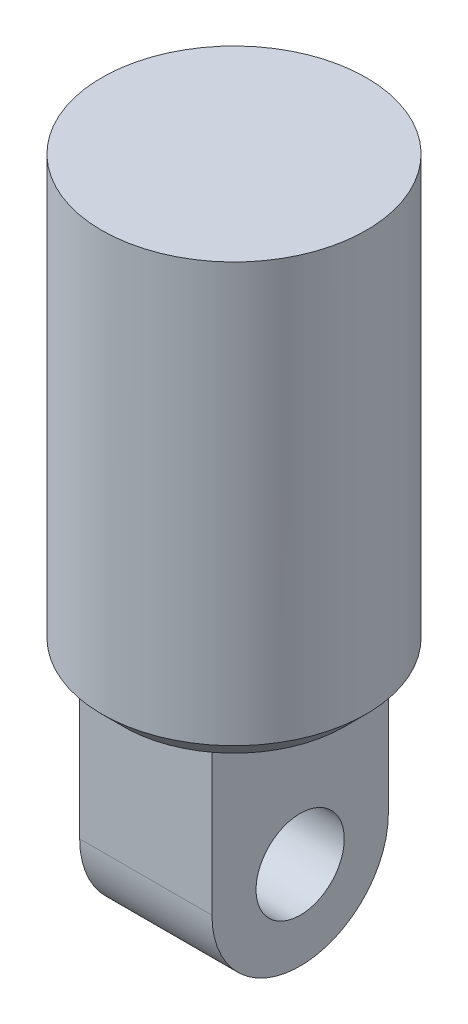
ISO-10303-21;
HEADER;
FILE_DESCRIPTION(('STEP AP214'),'2;1');
FILE_NAME('part.step','',(''),(''),'','','');
FILE_SCHEMA(('AUTOMOTIVE_DESIGN { 1 0 10303 214 1 1 1 1 }'));
ENDSEC;
DATA;
#1=APPLICATION_CONTEXT('core data for automotive mechanical design processes');
#2=APPLICATION_PROTOCOL_DEFINITION('international standard','automotive_design',2000,#1);
#3=PRODUCT_CONTEXT('',#1,'mechanical');
#4=PRODUCT('Part','Part','',(#3));
#5=PRODUCT_RELATED_PRODUCT_CATEGORY('part','',(#4));
#6=PRODUCT_DEFINITION_FORMATION('','',#4);
#7=PRODUCT_DEFINITION_CONTEXT('part definition',#1,'design');
#8=PRODUCT_DEFINITION('design','',#6,#7);
#9=PRODUCT_DEFINITION_SHAPE('','',#8);
#10=(LENGTH_UNIT() NAMED_UNIT(*) SI_UNIT(.MILLI.,.METRE.));
#11=(NAMED_UNIT(*) PLANE_ANGLE_UNIT() SI_UNIT($,.RADIAN.));
#12=(NAMED_UNIT(*) SI_UNIT($,.STERADIAN.) SOLID_ANGLE_UNIT());
#13=UNCERTAINTY_MEASURE_WITH_UNIT(LENGTH_MEASURE(1.E-05),#10,'distance_accuracy_value','');
#14=(GEOMETRIC_REPRESENTATION_CONTEXT(3) GLOBAL_UNCERTAINTY_ASSIGNED_CONTEXT((#13)) GLOBAL_UNIT_ASSIGNED_CONTEXT((#10,
#11,#12)) REPRESENTATION_CONTEXT('',''));
#15=CARTESIAN_POINT('',(0.,0.,0.));
#16=DIRECTION('',(0.,0.,1.));
#17=DIRECTION('',(1.,0.,0.));
#18=AXIS2_PLACEMENT_3D('',#15,#16,#17);
#19=CARTESIAN_POINT('',(30.,-100.,0.));
#20=DIRECTION('',(0.,-1.,0.));
#21=DIRECTION('',(0.,0.,-1.));
#22=AXIS2_PLACEMENT_3D('',#19,#20,#21);
#23=PLANE('',#22);
#24=DIRECTION('',(0.,0.,1.));
#25=VECTOR('',#24,1.);
#26=CARTESIAN_POINT('',(15.,-100.,20.));
#27=LINE('',#26,#25);
#28=CARTESIAN_POINT('',(15.,-100.,-20.));
#29=VERTEX_POINT('',#28);
#30=CARTESIAN_POINT('',(15.,-100.,20.));
#31=VERTEX_POINT('',#30);
#32=EDGE_CURVE('E93',#29,#31,#27,.T.);
#33=ORIENTED_EDGE('',*,*,#32,.F.);
#34=CARTESIAN_POINT('',(0.,-100.,0.));
#35=DIRECTION('',(0.,-1.,0.));
#36=DIRECTION('',(0.,0.,-1.));
#37=AXIS2_PLACEMENT_3D('',#34,#35,#36);
#38=CIRCLE('',#37,25.);
#39=EDGE_CURVE('E42',#29,#31,#38,.T.);
#40=ORIENTED_EDGE('',*,*,#39,.T.);
#41=EDGE_LOOP('',(#33,#40));
#42=FACE_BOUND('',#41,.T.);
#43=ADVANCED_FACE('F34',(#42),#23,.T.);
#44=DIRECTION('',(-1.,0.,0.));
#45=VECTOR('',#44,1.);
#46=CARTESIAN_POINT('',(15.,-100.,20.));
#47=LINE('',#46,#45);
#48=CARTESIAN_POINT('',(-15.,-100.,20.));
#49=VERTEX_POINT('',#48);
#50=EDGE_CURVE('E109',#31,#49,#47,.T.);
#51=ORIENTED_EDGE('',*,*,#50,.F.);
#52=CARTESIAN_POINT('',(0.,-100.,0.));
#53=DIRECTION('',(0.,-1.,0.));
#54=DIRECTION('',(0.,0.,-1.));
#55=AXIS2_PLACEMENT_3D('',#52,#53,#54);
#56=CIRCLE('',#55,25.);
#57=EDGE_CURVE('E49',#31,#49,#56,.T.);
#58=ORIENTED_EDGE('',*,*,#57,.T.);
#59=EDGE_LOOP('',(#51,#58));
#60=FACE_BOUND('',#59,.T.);
#61=ADVANCED_FACE('F124',(#60),#23,.T.);
#62=DIRECTION('',(0.,0.,1.));
#63=VECTOR('',#62,1.);
#64=CARTESIAN_POINT('',(-15.,-100.,20.));
#65=LINE('',#64,#63);
#66=CARTESIAN_POINT('',(-15.,-100.,-20.));
#67=VERTEX_POINT('',#66);
#68=EDGE_CURVE('E128',#67,#49,#65,.T.);
#69=ORIENTED_EDGE('',*,*,#68,.T.);
#70=CARTESIAN_POINT('',(0.,-100.,0.));
#71=DIRECTION('',(0.,-1.,0.));
#72=DIRECTION('',(0.,0.,-1.));
#73=AXIS2_PLACEMENT_3D('',#70,#71,#72);
#74=CIRCLE('',#73,25.);
#75=EDGE_CURVE('E114',#49,#67,#74,.T.);
#76=ORIENTED_EDGE('',*,*,#75,.T.);
#77=EDGE_LOOP('',(#69,#76));
#78=FACE_BOUND('',#77,.T.);
#79=ADVANCED_FACE('F163',(#78),#23,.T.);
#80=DIRECTION('',(-1.,0.,0.));
#81=VECTOR('',#80,1.);
#82=CARTESIAN_POINT('',(15.,-100.,-20.));
#83=LINE('',#82,#81);
#84=EDGE_CURVE('E91',#29,#67,#83,.T.);
#85=ORIENTED_EDGE('',*,*,#84,.T.);
#86=CARTESIAN_POINT('',(0.,-100.,0.));
#87=DIRECTION('',(0.,-1.,0.));
#88=DIRECTION('',(0.,0.,-1.));
#89=AXIS2_PLACEMENT_3D('',#86,#87,#88);
#90=CIRCLE('',#89,25.);
#91=EDGE_CURVE('E107',#67,#29,#90,.T.);
#92=ORIENTED_EDGE('',*,*,#91,.T.);
#93=EDGE_LOOP('',(#85,#92));
#94=FACE_BOUND('',#93,.T.);
#95=ADVANCED_FACE('F159',(#94),#23,.T.);
#96=CARTESIAN_POINT('',(0.,0.,0.));
#97=DIRECTION('',(0.,1.,0.));
#98=DIRECTION('',(0.,0.,1.));
#99=AXIS2_PLACEMENT_3D('',#96,#97,#98);
#100=PLANE('',#99);
#101=CARTESIAN_POINT('',(0.,0.,0.));
#102=DIRECTION('',(0.,-1.,0.));
#103=DIRECTION('',(0.,0.,-1.));
#104=AXIS2_PLACEMENT_3D('',#101,#102,#103);
#105=CIRCLE('',#104,30.);
#106=CARTESIAN_POINT('',(0.,0.,-30.));
#107=VERTEX_POINT('',#106);
#108=EDGE_CURVE('E104',#107,#107,#105,.T.);
#109=ORIENTED_EDGE('',*,*,#108,.F.);
#110=EDGE_LOOP('',(#109));
#111=FACE_BOUND('',#110,.T.);
#112=ADVANCED_FACE('F153',(#111),#100,.T.);
#113=CARTESIAN_POINT('',(0.,0.,0.));
#114=DIRECTION('',(0.,-1.,0.));
#115=DIRECTION('',(0.,0.,-1.));
#116=AXIS2_PLACEMENT_3D('',#113,#114,#115);
#117=CYLINDRICAL_SURFACE('',#116,30.);
#118=CARTESIAN_POINT('',(0.,-95.,0.));
#119=DIRECTION('',(0.,-1.,0.));
#120=DIRECTION('',(0.,0.,-1.));
#121=AXIS2_PLACEMENT_3D('',#118,#119,#120);
#122=CIRCLE('',#121,30.);
#123=CARTESIAN_POINT('',(0.,-95.,-30.));
#124=VERTEX_POINT('',#123);
#125=EDGE_CURVE('E11',#124,#124,#122,.F.);
#126=ORIENTED_EDGE('',*,*,#125,.T.);
#127=EDGE_LOOP('',(#126));
#128=FACE_BOUND('',#127,.T.);
#129=ORIENTED_EDGE('',*,*,#108,.T.);
#130=EDGE_LOOP('',(#129));
#131=FACE_BOUND('',#130,.T.);
#132=ADVANCED_FACE('F145',(#128,#131),#117,.T.);
#133=CARTESIAN_POINT('',(15.,-132.,0.));
#134=DIRECTION('',(1.,0.,0.));
#135=DIRECTION('',(0.,0.,-1.));
#136=AXIS2_PLACEMENT_3D('',#133,#134,#135);
#137=PLANE('',#136);
#138=CARTESIAN_POINT('',(15.,-132.,0.));
#139=DIRECTION('',(1.,0.,0.));
#140=DIRECTION('',(0.,0.,-1.));
#141=AXIS2_PLACEMENT_3D('',#138,#139,#140);
#142=CIRCLE('',#141,20.);
#143=CARTESIAN_POINT('',(15.,-132.,20.));
#144=VERTEX_POINT('',#143);
#145=CARTESIAN_POINT('',(15.,-132.,-20.));
#146=VERTEX_POINT('',#145);
#147=EDGE_CURVE('E94',#144,#146,#142,.T.);
#148=ORIENTED_EDGE('',*,*,#147,.T.);
#149=DIRECTION('',(0.,1.,0.));
#150=VECTOR('',#149,1.);
#151=CARTESIAN_POINT('',(15.,-100.,-20.));
#152=LINE('',#151,#150);
#153=EDGE_CURVE('E84',#146,#29,#152,.T.);
#154=ORIENTED_EDGE('',*,*,#153,.T.);
#155=ORIENTED_EDGE('',*,*,#32,.T.);
#156=DIRECTION('',(0.,-1.,0.));
#157=VECTOR('',#156,1.);
#158=CARTESIAN_POINT('',(15.,-132.,20.));
#159=LINE('',#158,#157);
#160=EDGE_CURVE('E58',#31,#144,#159,.T.);
#161=ORIENTED_EDGE('',*,*,#160,.T.);
#162=EDGE_LOOP('',(#148,#154,#155,#161));
#163=FACE_BOUND('',#162,.T.);
#164=CARTESIAN_POINT('',(15.,-132.,0.));
#165=DIRECTION('',(1.,0.,0.));
#166=DIRECTION('',(0.,0.,-1.));
#167=AXIS2_PLACEMENT_3D('',#164,#165,#166);
#168=CIRCLE('',#167,10.);
#169=CARTESIAN_POINT('',(15.,-132.,-10.));
#170=VERTEX_POINT('',#169);
#171=EDGE_CURVE('E133',#170,#170,#168,.T.);
#172=ORIENTED_EDGE('',*,*,#171,.F.);
#173=EDGE_LOOP('',(#172));
#174=FACE_BOUND('',#173,.T.);
#175=ADVANCED_FACE('F97',(#163,#174),#137,.T.);
#176=CARTESIAN_POINT('',(-15.,-132.,0.));
#177=DIRECTION('',(1.,0.,0.));
#178=DIRECTION('',(0.,0.,-1.));
#179=AXIS2_PLACEMENT_3D('',#176,#177,#178);
#180=PLANE('',#179);
#181=CARTESIAN_POINT('',(-15.,-132.,0.));
#182=DIRECTION('',(1.,0.,0.));
#183=DIRECTION('',(0.,0.,-1.));
#184=AXIS2_PLACEMENT_3D('',#181,#182,#183);
#185=CIRCLE('',#184,20.);
#186=CARTESIAN_POINT('',(-15.,-132.,20.));
#187=VERTEX_POINT('',#186);
#188=CARTESIAN_POINT('',(-15.,-132.,-20.));
#189=VERTEX_POINT('',#188);
#190=EDGE_CURVE('E103',#187,#189,#185,.T.);
#191=ORIENTED_EDGE('',*,*,#190,.F.);
#192=DIRECTION('',(0.,-1.,0.));
#193=VECTOR('',#192,1.);
#194=CARTESIAN_POINT('',(-15.,-132.,20.));
#195=LINE('',#194,#193);
#196=EDGE_CURVE('E77',#49,#187,#195,.T.);
#197=ORIENTED_EDGE('',*,*,#196,.F.);
#198=ORIENTED_EDGE('',*,*,#68,.F.);
#199=DIRECTION('',(0.,1.,0.));
#200=VECTOR('',#199,1.);
#201=CARTESIAN_POINT('',(-15.,-100.,-20.));
#202=LINE('',#201,#200);
#203=EDGE_CURVE('E131',#189,#67,#202,.T.);
#204=ORIENTED_EDGE('',*,*,#203,.F.);
#205=EDGE_LOOP('',(#191,#197,#198,#204));
#206=FACE_BOUND('',#205,.T.);
#207=CARTESIAN_POINT('',(-15.,-132.,0.));
#208=DIRECTION('',(1.,0.,0.));
#209=DIRECTION('',(0.,0.,-1.));
#210=AXIS2_PLACEMENT_3D('',#207,#208,#209);
#211=CIRCLE('',#210,10.);
#212=CARTESIAN_POINT('',(-15.,-132.,-10.));
#213=VERTEX_POINT('',#212);
#214=EDGE_CURVE('E135',#213,#213,#211,.T.);
#215=ORIENTED_EDGE('',*,*,#214,.T.);
#216=EDGE_LOOP('',(#215));
#217=FACE_BOUND('',#216,.T.);
#218=ADVANCED_FACE('F144',(#206,#217),#180,.F.);
#219=CARTESIAN_POINT('',(15.,-132.,0.));
#220=DIRECTION('',(-1.,0.,0.));
#221=DIRECTION('',(0.,0.,1.));
#222=AXIS2_PLACEMENT_3D('',#219,#220,#221);
#223=CYLINDRICAL_SURFACE('',#222,20.);
#224=ORIENTED_EDGE('',*,*,#190,.T.);
#225=DIRECTION('',(-1.,0.,0.));
#226=VECTOR('',#225,1.);
#227=CARTESIAN_POINT('',(15.,-132.,-20.));
#228=LINE('',#227,#226);
#229=EDGE_CURVE('E88',#146,#189,#228,.T.);
#230=ORIENTED_EDGE('',*,*,#229,.F.);
#231=ORIENTED_EDGE('',*,*,#147,.F.);
#232=DIRECTION('',(-1.,0.,0.));
#233=VECTOR('',#232,1.);
#234=CARTESIAN_POINT('',(15.,-132.,20.));
#235=LINE('',#234,#233);
#236=EDGE_CURVE('E120',#144,#187,#235,.T.);
#237=ORIENTED_EDGE('',*,*,#236,.T.);
#238=EDGE_LOOP('',(#224,#230,#231,#237));
#239=FACE_BOUND('',#238,.T.);
#240=ADVANCED_FACE('F101',(#239),#223,.T.);
#241=CARTESIAN_POINT('',(15.,-100.,-20.));
#242=DIRECTION('',(0.,0.,1.));
#243=DIRECTION('',(0.,-1.,0.));
#244=AXIS2_PLACEMENT_3D('',#241,#242,#243);
#245=PLANE('',#244);
#246=ORIENTED_EDGE('',*,*,#203,.T.);
#247=ORIENTED_EDGE('',*,*,#84,.F.);
#248=ORIENTED_EDGE('',*,*,#153,.F.);
#249=ORIENTED_EDGE('',*,*,#229,.T.);
#250=EDGE_LOOP('',(#246,#247,#248,#249));
#251=FACE_BOUND('',#250,.T.);
#252=ADVANCED_FACE('F86',(#251),#245,.F.);
#253=CARTESIAN_POINT('',(15.,-132.,20.));
#254=DIRECTION('',(0.,0.,-1.));
#255=DIRECTION('',(0.,1.,0.));
#256=AXIS2_PLACEMENT_3D('',#253,#254,#255);
#257=PLANE('',#256);
#258=ORIENTED_EDGE('',*,*,#196,.T.);
#259=ORIENTED_EDGE('',*,*,#236,.F.);
#260=ORIENTED_EDGE('',*,*,#160,.F.);
#261=ORIENTED_EDGE('',*,*,#50,.T.);
#262=EDGE_LOOP('',(#258,#259,#260,#261));
#263=FACE_BOUND('',#262,.T.);
#264=ADVANCED_FACE('F118',(#263),#257,.F.);
#265=CARTESIAN_POINT('',(15.,-132.,0.));
#266=DIRECTION('',(-1.,0.,0.));
#267=DIRECTION('',(0.,0.,1.));
#268=AXIS2_PLACEMENT_3D('',#265,#266,#267);
#269=CYLINDRICAL_SURFACE('',#268,10.);
#270=ORIENTED_EDGE('',*,*,#171,.T.);
#271=EDGE_LOOP('',(#270));
#272=FACE_BOUND('',#271,.T.);
#273=ORIENTED_EDGE('',*,*,#214,.F.);
#274=EDGE_LOOP('',(#273));
#275=FACE_BOUND('',#274,.T.);
#276=ADVANCED_FACE('F141',(#272,#275),#269,.F.);
#277=CARTESIAN_POINT('',(0.,-100.,0.));
#278=DIRECTION('',(0.,1.,0.));
#279=DIRECTION('',(0.,0.,1.));
#280=AXIS2_PLACEMENT_3D('',#277,#278,#279);
#281=CONICAL_SURFACE('',#280,25.,0.785398163397448);
#282=ORIENTED_EDGE('',*,*,#125,.F.);
#283=EDGE_LOOP('',(#282));
#284=FACE_BOUND('',#283,.T.);
#285=ORIENTED_EDGE('',*,*,#57,.F.);
#286=ORIENTED_EDGE('',*,*,#39,.F.);
#287=ORIENTED_EDGE('',*,*,#91,.F.);
#288=ORIENTED_EDGE('',*,*,#75,.F.);
#289=EDGE_LOOP('',(#285,#286,#287,#288));
#290=FACE_BOUND('',#289,.T.);
#291=ADVANCED_FACE('F36',(#284,#290),#281,.T.);
#292=CLOSED_SHELL('',(#43,#61,#79,#95,#112,#132,#175,#218,#240,#252,#264,#276,#291));
#293=MANIFOLD_SOLID_BREP('B2',#292);
#294=ADVANCED_BREP_SHAPE_REPRESENTATION('',(#18,#293),#14);
#295=SHAPE_DEFINITION_REPRESENTATION(#9,#294);
ENDSEC;
END-ISO-10303-21;
